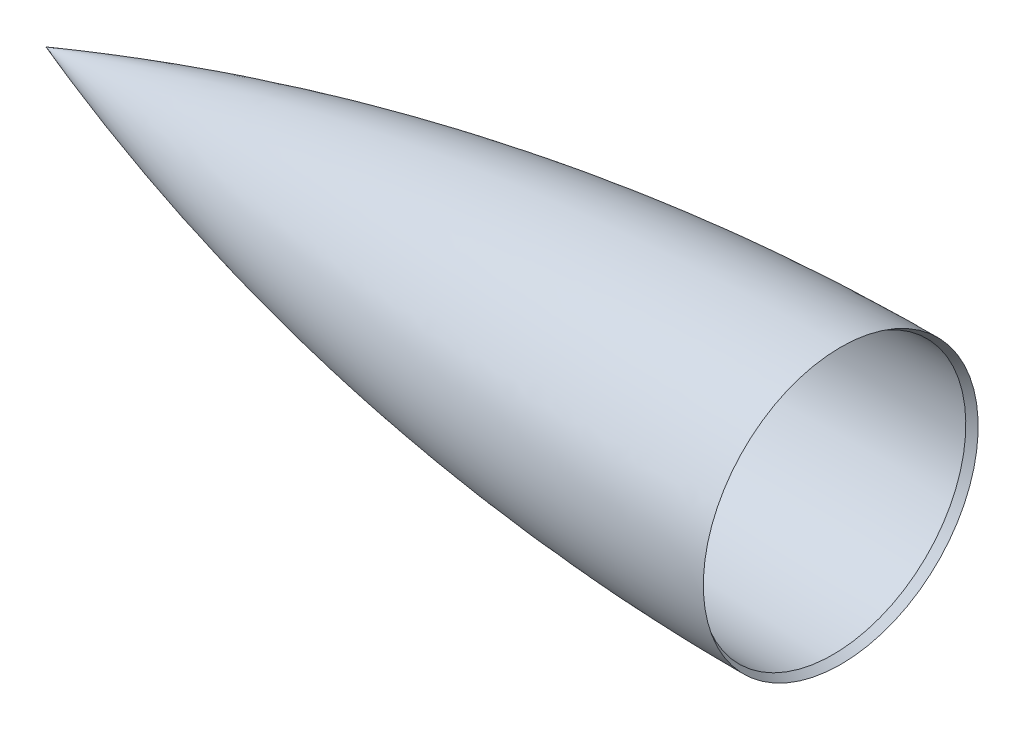
ISO-10303-21;
HEADER;
FILE_DESCRIPTION(('STEP AP214'),'2;1');
FILE_NAME('part.step','',(''),(''),'','','');
FILE_SCHEMA(('AUTOMOTIVE_DESIGN { 1 0 10303 214 1 1 1 1 }'));
ENDSEC;
DATA;
#1=APPLICATION_CONTEXT('core data for automotive mechanical design processes');
#2=APPLICATION_PROTOCOL_DEFINITION('international standard','automotive_design',2000,#1);
#3=PRODUCT_CONTEXT('',#1,'mechanical');
#4=PRODUCT('Part','Part','',(#3));
#5=PRODUCT_RELATED_PRODUCT_CATEGORY('part','',(#4));
#6=PRODUCT_DEFINITION_FORMATION('','',#4);
#7=PRODUCT_DEFINITION_CONTEXT('part definition',#1,'design');
#8=PRODUCT_DEFINITION('design','',#6,#7);
#9=PRODUCT_DEFINITION_SHAPE('','',#8);
#10=(LENGTH_UNIT() NAMED_UNIT(*) SI_UNIT(.MILLI.,.METRE.));
#11=(NAMED_UNIT(*) PLANE_ANGLE_UNIT() SI_UNIT($,.RADIAN.));
#12=(NAMED_UNIT(*) SI_UNIT($,.STERADIAN.) SOLID_ANGLE_UNIT());
#13=UNCERTAINTY_MEASURE_WITH_UNIT(LENGTH_MEASURE(1.E-05),#10,'distance_accuracy_value','');
#14=(GEOMETRIC_REPRESENTATION_CONTEXT(3) GLOBAL_UNCERTAINTY_ASSIGNED_CONTEXT((#13)) GLOBAL_UNIT_ASSIGNED_CONTEXT((#10,
#11,#12)) REPRESENTATION_CONTEXT('',''));
#15=CARTESIAN_POINT('',(0.,0.,0.));
#16=DIRECTION('',(0.,0.,1.));
#17=DIRECTION('',(1.,0.,0.));
#18=AXIS2_PLACEMENT_3D('',#15,#16,#17);
#19=CARTESIAN_POINT('',(-79.2,0.,0.));
#20=DIRECTION('',(1.,0.,0.));
#21=DIRECTION('',(0.,1.,0.));
#22=AXIS2_PLACEMENT_3D('',#19,#20,#21);
#23=CONICAL_SURFACE('',#22,33.6763552916098,0.523598775598344);
#24=CARTESIAN_POINT('',(-82.9447811604997,0.,0.));
#25=DIRECTION('',(1.,0.,0.));
#26=DIRECTION('',(0.,1.,0.));
#27=AXIS2_PLACEMENT_3D('',#24,#25,#26);
#28=CIRCLE('',#27,31.5143048805389);
#29=CARTESIAN_POINT('',(-82.9447811604997,31.5143048805388,0.));
#30=VERTEX_POINT('',#29);
#31=EDGE_CURVE('E76',#30,#30,#28,.T.);
#32=ORIENTED_EDGE('',*,*,#31,.F.);
#33=EDGE_LOOP('',(#32));
#34=FACE_BOUND('',#33,.T.);
#35=CARTESIAN_POINT('',(-79.2,0.,0.));
#36=DIRECTION('',(1.,0.,0.));
#37=DIRECTION('',(0.,1.,0.));
#38=AXIS2_PLACEMENT_3D('',#35,#36,#37);
#39=CIRCLE('',#38,33.6763552916098);
#40=CARTESIAN_POINT('',(-79.2,33.6763552916098,0.));
#41=VERTEX_POINT('',#40);
#42=EDGE_CURVE('E11',#41,#41,#39,.T.);
#43=ORIENTED_EDGE('',*,*,#42,.T.);
#44=EDGE_LOOP('',(#43));
#45=FACE_BOUND('',#44,.T.);
#46=ADVANCED_FACE('F38',(#34,#45),#23,.F.);
#47=CARTESIAN_POINT('',(0.,0.,0.));
#48=DIRECTION('',(1.,0.,0.));
#49=DIRECTION('',(0.,1.,0.));
#50=AXIS2_PLACEMENT_3D('',#47,#48,#49);
#51=DEGENERATE_TOROIDAL_SURFACE('',#50,642.33383838384,680.63383838384,.F.);
#52=CARTESIAN_POINT('',(-2.25815426892606,0.,0.));
#53=DIRECTION('',(1.,0.,0.));
#54=DIRECTION('',(0.,1.,0.));
#55=AXIS2_PLACEMENT_3D('',#52,#53,#54);
#56=CIRCLE('',#55,38.2962540249638);
#57=CARTESIAN_POINT('',(-2.25815426892606,38.2962540249638,0.));
#58=VERTEX_POINT('',#57);
#59=EDGE_CURVE('E45',#58,#58,#56,.T.);
#60=ORIENTED_EDGE('',*,*,#59,.T.);
#61=EDGE_LOOP('',(#60));
#62=FACE_BOUND('',#61,.T.);
#63=ORIENTED_EDGE('',*,*,#42,.F.);
#64=EDGE_LOOP('',(#63));
#65=FACE_BOUND('',#64,.T.);
#66=ADVANCED_FACE('F63',(#62,#65),#51,.T.);
#67=CARTESIAN_POINT('',(0.,0.,0.));
#68=DIRECTION('',(1.,0.,0.));
#69=DIRECTION('',(0.,1.,0.));
#70=AXIS2_PLACEMENT_3D('',#67,#68,#69);
#71=CONICAL_SURFACE('',#70,39.6,0.523598775598306);
#72=ORIENTED_EDGE('',*,*,#59,.F.);
#73=EDGE_LOOP('',(#72));
#74=FACE_BOUND('',#73,.T.);
#75=CARTESIAN_POINT('',(0.,0.,0.));
#76=DIRECTION('',(1.,0.,0.));
#77=DIRECTION('',(0.,1.,0.));
#78=AXIS2_PLACEMENT_3D('',#75,#76,#77);
#79=CIRCLE('',#78,39.6);
#80=CARTESIAN_POINT('',(0.,39.6,0.));
#81=VERTEX_POINT('',#80);
#82=EDGE_CURVE('E79',#81,#81,#79,.T.);
#83=ORIENTED_EDGE('',*,*,#82,.T.);
#84=EDGE_LOOP('',(#83));
#85=FACE_BOUND('',#84,.T.);
#86=ADVANCED_FACE('F54',(#74,#85),#71,.F.);
#87=CARTESIAN_POINT('',(0.,-642.33383838384,0.));
#88=DIRECTION('',(0.,0.,-1.));
#89=DIRECTION('',(0.,1.,0.));
#90=AXIS2_PLACEMENT_3D('',#87,#88,#89);
#91=CIRCLE('',#90,681.93383838384);
#92=TRIMMED_CURVE('',#91,(PARAMETER_VALUE(-0.342464720280552)),
(PARAMETER_VALUE(0.342464720280552)),.T.,.PARAMETER.);
#93=CARTESIAN_POINT('',(0.,0.,0.));
#94=DIRECTION('',(1.,0.,0.));
#95=AXIS1_PLACEMENT('',#93,#94);
#96=SURFACE_OF_REVOLUTION('',#92,#95);
#97=ORIENTED_EDGE('',*,*,#82,.F.);
#98=EDGE_LOOP('',(#97));
#99=FACE_BOUND('',#98,.T.);
#100=CARTESIAN_POINT('',(-229.,-7.9350408246198E-13,0.));
#101=VERTEX_POINT('',#100);
#102=VERTEX_LOOP('',#101);
#103=FACE_BOUND('',#102,.T.);
#104=ADVANCED_FACE('F51',(#99,#103),#96,.T.);
#105=CARTESIAN_POINT('',(0.,-642.33383838384,0.));
#106=DIRECTION('',(0.,0.,-1.));
#107=DIRECTION('',(0.,1.,0.));
#108=AXIS2_PLACEMENT_3D('',#105,#106,#107);
#109=CIRCLE('',#108,678.93383838384);
#110=TRIMMED_CURVE('',#109,(PARAMETER_VALUE(-0.329846882865527)),
(PARAMETER_VALUE(0.329846882865527)),.T.,.PARAMETER.);
#111=CARTESIAN_POINT('',(0.,0.,0.));
#112=DIRECTION('',(1.,0.,0.));
#113=AXIS1_PLACEMENT('',#111,#112);
#114=SURFACE_OF_REVOLUTION('',#110,#113);
#115=ORIENTED_EDGE('',*,*,#31,.T.);
#116=EDGE_LOOP('',(#115));
#117=FACE_BOUND('',#116,.T.);
#118=CARTESIAN_POINT('',(-219.905427331153,-7.61990630317975E-13,0.));
#119=VERTEX_POINT('',#118);
#120=VERTEX_LOOP('',#119);
#121=FACE_BOUND('',#120,.T.);
#122=ADVANCED_FACE('F53',(#117,#121),#114,.F.);
#123=CLOSED_SHELL('',(#46,#66,#86,#104,#122));
#124=MANIFOLD_SOLID_BREP('B2',#123);
#125=ADVANCED_BREP_SHAPE_REPRESENTATION('',(#18,#124),#14);
#126=SHAPE_DEFINITION_REPRESENTATION(#9,#125);
ENDSEC;
END-ISO-10303-21;
